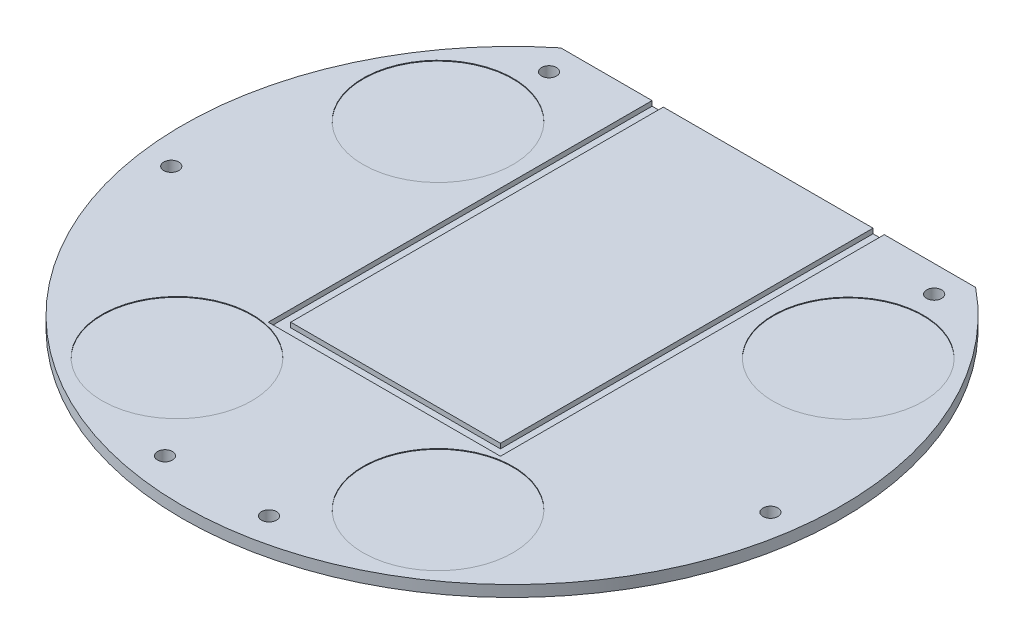
ISO-10303-21;
HEADER;
FILE_DESCRIPTION(('STEP AP214'),'2;1');
FILE_NAME('part.step','',(''),(''),'','','');
FILE_SCHEMA(('AUTOMOTIVE_DESIGN { 1 0 10303 214 1 1 1 1 }'));
ENDSEC;
DATA;
#1=APPLICATION_CONTEXT('core data for automotive mechanical design processes');
#2=APPLICATION_PROTOCOL_DEFINITION('international standard','automotive_design',2000,#1);
#3=PRODUCT_CONTEXT('',#1,'mechanical');
#4=PRODUCT('Part','Part','',(#3));
#5=PRODUCT_RELATED_PRODUCT_CATEGORY('part','',(#4));
#6=PRODUCT_DEFINITION_FORMATION('','',#4);
#7=PRODUCT_DEFINITION_CONTEXT('part definition',#1,'design');
#8=PRODUCT_DEFINITION('design','',#6,#7);
#9=PRODUCT_DEFINITION_SHAPE('','',#8);
#10=(LENGTH_UNIT() NAMED_UNIT(*) SI_UNIT(.MILLI.,.METRE.));
#11=(NAMED_UNIT(*) PLANE_ANGLE_UNIT() SI_UNIT($,.RADIAN.));
#12=(NAMED_UNIT(*) SI_UNIT($,.STERADIAN.) SOLID_ANGLE_UNIT());
#13=UNCERTAINTY_MEASURE_WITH_UNIT(LENGTH_MEASURE(1.E-05),#10,'distance_accuracy_value','');
#14=(GEOMETRIC_REPRESENTATION_CONTEXT(3) GLOBAL_UNCERTAINTY_ASSIGNED_CONTEXT((#13)) GLOBAL_UNIT_ASSIGNED_CONTEXT((#10,
#11,#12)) REPRESENTATION_CONTEXT('',''));
#15=CARTESIAN_POINT('',(0.,0.,0.));
#16=DIRECTION('',(0.,0.,1.));
#17=DIRECTION('',(1.,0.,0.));
#18=AXIS2_PLACEMENT_3D('',#15,#16,#17);
#19=CARTESIAN_POINT('',(0.,3.,-68.3888446082133));
#20=DIRECTION('',(0.,0.,1.));
#21=DIRECTION('',(1.,0.,0.));
#22=AXIS2_PLACEMENT_3D('',#19,#20,#21);
#23=PLANE('',#22);
#24=DIRECTION('',(0.,1.,0.));
#25=VECTOR('',#24,1.);
#26=CARTESIAN_POINT('',(28.,1.7,-68.3888446082133));
#27=LINE('',#26,#25);
#28=CARTESIAN_POINT('',(28.,1.7,-68.3888446082133));
#29=VERTEX_POINT('',#28);
#30=CARTESIAN_POINT('',(28.,3.,-68.3888446082133));
#31=VERTEX_POINT('',#30);
#32=EDGE_CURVE('E209',#29,#31,#27,.T.);
#33=ORIENTED_EDGE('',*,*,#32,.F.);
#34=DIRECTION('',(-1.,0.,0.));
#35=VECTOR('',#34,1.);
#36=CARTESIAN_POINT('',(0.,1.7,-68.3888446082133));
#37=LINE('',#36,#35);
#38=CARTESIAN_POINT('',(31.,1.7,-68.3888446082133));
#39=VERTEX_POINT('',#38);
#40=EDGE_CURVE('E166',#39,#29,#37,.T.);
#41=ORIENTED_EDGE('',*,*,#40,.F.);
#42=DIRECTION('',(0.,1.,0.));
#43=VECTOR('',#42,1.);
#44=CARTESIAN_POINT('',(31.,1.7,-68.3888446082133));
#45=LINE('',#44,#43);
#46=CARTESIAN_POINT('',(31.,3.,-68.3888446082133));
#47=VERTEX_POINT('',#46);
#48=EDGE_CURVE('E212',#39,#47,#45,.T.);
#49=ORIENTED_EDGE('',*,*,#48,.T.);
#50=DIRECTION('',(-1.,0.,0.));
#51=VECTOR('',#50,1.);
#52=CARTESIAN_POINT('',(0.,3.,-68.3888446082133));
#53=LINE('',#52,#51);
#54=CARTESIAN_POINT('',(55.3801944123858,3.,-68.3888446082133));
#55=VERTEX_POINT('',#54);
#56=EDGE_CURVE('E88',#55,#47,#53,.T.);
#57=ORIENTED_EDGE('',*,*,#56,.F.);
#58=DIRECTION('',(0.,-1.,0.));
#59=VECTOR('',#58,1.);
#60=CARTESIAN_POINT('',(55.3801944123858,3.,-68.3888446082133));
#61=LINE('',#60,#59);
#62=CARTESIAN_POINT('',(55.3801944123858,0.,-68.3888446082133));
#63=VERTEX_POINT('',#62);
#64=EDGE_CURVE('E11',#55,#63,#61,.T.);
#65=ORIENTED_EDGE('',*,*,#64,.T.);
#66=DIRECTION('',(-1.,0.,0.));
#67=VECTOR('',#66,1.);
#68=CARTESIAN_POINT('',(0.,0.,-68.3888446082133));
#69=LINE('',#68,#67);
#70=CARTESIAN_POINT('',(-55.3801944123858,0.,-68.3888446082133));
#71=VERTEX_POINT('',#70);
#72=EDGE_CURVE('E76',#63,#71,#69,.T.);
#73=ORIENTED_EDGE('',*,*,#72,.T.);
#74=DIRECTION('',(0.,-1.,0.));
#75=VECTOR('',#74,1.);
#76=CARTESIAN_POINT('',(-55.3801944123858,3.,-68.3888446082133));
#77=LINE('',#76,#75);
#78=CARTESIAN_POINT('',(-55.3801944123858,3.,-68.3888446082133));
#79=VERTEX_POINT('',#78);
#80=EDGE_CURVE('E47',#79,#71,#77,.T.);
#81=ORIENTED_EDGE('',*,*,#80,.F.);
#82=CARTESIAN_POINT('',(-31.,3.,-68.3888446082133));
#83=VERTEX_POINT('',#82);
#84=EDGE_CURVE('E64',#83,#79,#53,.T.);
#85=ORIENTED_EDGE('',*,*,#84,.F.);
#86=DIRECTION('',(0.,1.,0.));
#87=VECTOR('',#86,1.);
#88=CARTESIAN_POINT('',(-31.,1.7,-68.3888446082133));
#89=LINE('',#88,#87);
#90=CARTESIAN_POINT('',(-31.,1.7,-68.3888446082133));
#91=VERTEX_POINT('',#90);
#92=EDGE_CURVE('E93',#91,#83,#89,.T.);
#93=ORIENTED_EDGE('',*,*,#92,.F.);
#94=CARTESIAN_POINT('',(-28.,1.7,-68.3888446082133));
#95=VERTEX_POINT('',#94);
#96=EDGE_CURVE('E170',#95,#91,#37,.T.);
#97=ORIENTED_EDGE('',*,*,#96,.F.);
#98=DIRECTION('',(0.,1.,0.));
#99=VECTOR('',#98,1.);
#100=CARTESIAN_POINT('',(-28.,1.7,-68.3888446082133));
#101=LINE('',#100,#99);
#102=CARTESIAN_POINT('',(-28.,3.,-68.3888446082133));
#103=VERTEX_POINT('',#102);
#104=EDGE_CURVE('E200',#95,#103,#101,.T.);
#105=ORIENTED_EDGE('',*,*,#104,.T.);
#106=EDGE_CURVE('E216',#31,#103,#53,.T.);
#107=ORIENTED_EDGE('',*,*,#106,.F.);
#108=EDGE_LOOP('',(#33,#41,#49,#57,#65,#73,#81,#85,#93,#97,#105,#107));
#109=FACE_BOUND('',#108,.T.);
#110=ADVANCED_FACE('F38',(#109),#23,.F.);
#111=CARTESIAN_POINT('',(0.,3.,0.));
#112=DIRECTION('',(0.,1.,0.));
#113=DIRECTION('',(0.,0.,1.));
#114=AXIS2_PLACEMENT_3D('',#111,#112,#113);
#115=PLANE('',#114);
#116=DIRECTION('',(0.,0.,-1.));
#117=VECTOR('',#116,1.);
#118=CARTESIAN_POINT('',(-28.,3.,0.));
#119=LINE('',#118,#117);
#120=CARTESIAN_POINT('',(-28.,3.,31.1));
#121=VERTEX_POINT('',#120);
#122=EDGE_CURVE('E193',#121,#103,#119,.T.);
#123=ORIENTED_EDGE('',*,*,#122,.F.);
#124=DIRECTION('',(1.,0.,0.));
#125=VECTOR('',#124,1.);
#126=CARTESIAN_POINT('',(0.,3.,31.1));
#127=LINE('',#126,#125);
#128=CARTESIAN_POINT('',(28.,3.,31.1));
#129=VERTEX_POINT('',#128);
#130=EDGE_CURVE('E190',#121,#129,#127,.T.);
#131=ORIENTED_EDGE('',*,*,#130,.T.);
#132=DIRECTION('',(0.,0.,-1.));
#133=VECTOR('',#132,1.);
#134=CARTESIAN_POINT('',(28.,3.,0.));
#135=LINE('',#134,#133);
#136=EDGE_CURVE('E187',#129,#31,#135,.T.);
#137=ORIENTED_EDGE('',*,*,#136,.T.);
#138=ORIENTED_EDGE('',*,*,#106,.T.);
#139=EDGE_LOOP('',(#123,#131,#137,#138));
#140=FACE_BOUND('',#139,.T.);
#141=ADVANCED_FACE('F271',(#140),#115,.T.);
#142=CARTESIAN_POINT('',(0.,3.,0.));
#143=DIRECTION('',(0.,-1.,0.));
#144=DIRECTION('',(0.,0.,-1.));
#145=AXIS2_PLACEMENT_3D('',#142,#143,#144);
#146=CYLINDRICAL_SURFACE('',#145,88.);
#147=CARTESIAN_POINT('',(0.,0.,0.));
#148=DIRECTION('',(0.,1.,0.));
#149=DIRECTION('',(0.,0.,1.));
#150=AXIS2_PLACEMENT_3D('',#147,#148,#149);
#151=CIRCLE('',#150,88.);
#152=EDGE_CURVE('E85',#71,#63,#151,.T.);
#153=ORIENTED_EDGE('',*,*,#152,.T.);
#154=ORIENTED_EDGE('',*,*,#64,.F.);
#155=CARTESIAN_POINT('',(0.,3.,0.));
#156=DIRECTION('',(0.,1.,0.));
#157=DIRECTION('',(0.,0.,1.));
#158=AXIS2_PLACEMENT_3D('',#155,#156,#157);
#159=CIRCLE('',#158,88.);
#160=EDGE_CURVE('E84',#79,#55,#159,.T.);
#161=ORIENTED_EDGE('',*,*,#160,.F.);
#162=ORIENTED_EDGE('',*,*,#80,.T.);
#163=EDGE_LOOP('',(#153,#154,#161,#162));
#164=FACE_BOUND('',#163,.T.);
#165=ADVANCED_FACE('F40',(#164),#146,.T.);
#166=CARTESIAN_POINT('',(-80.,3.,11.));
#167=DIRECTION('',(0.,1.,0.));
#168=DIRECTION('',(0.,0.,1.));
#169=AXIS2_PLACEMENT_3D('',#166,#167,#168);
#170=CIRCLE('',#169,2.);
#171=CARTESIAN_POINT('',(-80.,3.,13.));
#172=VERTEX_POINT('',#171);
#173=EDGE_CURVE('E99',#172,#172,#170,.T.);
#174=ORIENTED_EDGE('',*,*,#173,.F.);
#175=EDGE_LOOP('',(#174));
#176=FACE_BOUND('',#175,.T.);
#177=CARTESIAN_POINT('',(80.,3.,11.));
#178=DIRECTION('',(0.,1.,0.));
#179=DIRECTION('',(0.,0.,1.));
#180=AXIS2_PLACEMENT_3D('',#177,#178,#179);
#181=CIRCLE('',#180,2.);
#182=CARTESIAN_POINT('',(80.,3.,13.));
#183=VERTEX_POINT('',#182);
#184=EDGE_CURVE('E105',#183,#183,#181,.T.);
#185=ORIENTED_EDGE('',*,*,#184,.F.);
#186=EDGE_LOOP('',(#185));
#187=FACE_BOUND('',#186,.T.);
#188=CARTESIAN_POINT('',(-51.423008774923,3.,-61.2835554495184));
#189=DIRECTION('',(0.,1.,0.));
#190=DIRECTION('',(0.,0.,1.));
#191=AXIS2_PLACEMENT_3D('',#188,#189,#190);
#192=CIRCLE('',#191,2.);
#193=CARTESIAN_POINT('',(-51.423008774923,3.,-59.2835554495183));
#194=VERTEX_POINT('',#193);
#195=EDGE_CURVE('E103',#194,#194,#192,.T.);
#196=ORIENTED_EDGE('',*,*,#195,.F.);
#197=EDGE_LOOP('',(#196));
#198=FACE_BOUND('',#197,.T.);
#199=CARTESIAN_POINT('',(51.423008774923,3.,-61.2835554495184));
#200=DIRECTION('',(0.,1.,0.));
#201=DIRECTION('',(0.,0.,1.));
#202=AXIS2_PLACEMENT_3D('',#199,#200,#201);
#203=CIRCLE('',#202,2.);
#204=CARTESIAN_POINT('',(51.423008774923,3.,-59.2835554495183));
#205=VERTEX_POINT('',#204);
#206=EDGE_CURVE('E117',#205,#205,#203,.T.);
#207=ORIENTED_EDGE('',*,*,#206,.F.);
#208=EDGE_LOOP('',(#207));
#209=FACE_BOUND('',#208,.T.);
#210=CARTESIAN_POINT('',(13.8918542133542,3.,78.7846202409767));
#211=DIRECTION('',(0.,1.,0.));
#212=DIRECTION('',(0.,0.,1.));
#213=AXIS2_PLACEMENT_3D('',#210,#211,#212);
#214=CIRCLE('',#213,2.);
#215=CARTESIAN_POINT('',(13.8918542133542,3.,80.7846202409767));
#216=VERTEX_POINT('',#215);
#217=EDGE_CURVE('E123',#216,#216,#214,.T.);
#218=ORIENTED_EDGE('',*,*,#217,.F.);
#219=EDGE_LOOP('',(#218));
#220=FACE_BOUND('',#219,.T.);
#221=CARTESIAN_POINT('',(-13.8918542133542,3.,78.7846202409767));
#222=DIRECTION('',(0.,1.,0.));
#223=DIRECTION('',(0.,0.,1.));
#224=AXIS2_PLACEMENT_3D('',#221,#222,#223);
#225=CIRCLE('',#224,2.);
#226=CARTESIAN_POINT('',(-13.8918542133542,3.,80.7846202409767));
#227=VERTEX_POINT('',#226);
#228=EDGE_CURVE('E129',#227,#227,#225,.T.);
#229=ORIENTED_EDGE('',*,*,#228,.F.);
#230=EDGE_LOOP('',(#229));
#231=FACE_BOUND('',#230,.T.);
#232=CARTESIAN_POINT('',(54.772,3.,-35.));
#233=DIRECTION('',(0.,1.,0.));
#234=DIRECTION('',(0.,0.,1.));
#235=AXIS2_PLACEMENT_3D('',#232,#233,#234);
#236=CIRCLE('',#235,20.);
#237=CARTESIAN_POINT('',(54.772,3.,-15.));
#238=VERTEX_POINT('',#237);
#239=EDGE_CURVE('E135',#238,#238,#236,.T.);
#240=ORIENTED_EDGE('',*,*,#239,.F.);
#241=EDGE_LOOP('',(#240));
#242=FACE_BOUND('',#241,.T.);
#243=CARTESIAN_POINT('',(-54.772,3.,-35.));
#244=DIRECTION('',(0.,1.,0.));
#245=DIRECTION('',(0.,0.,1.));
#246=AXIS2_PLACEMENT_3D('',#243,#244,#245);
#247=CIRCLE('',#246,20.);
#248=CARTESIAN_POINT('',(-54.772,3.,-15.));
#249=VERTEX_POINT('',#248);
#250=EDGE_CURVE('E146',#249,#249,#247,.T.);
#251=ORIENTED_EDGE('',*,*,#250,.F.);
#252=EDGE_LOOP('',(#251));
#253=FACE_BOUND('',#252,.T.);
#254=CARTESIAN_POINT('',(-35.,3.,54.472));
#255=DIRECTION('',(0.,1.,0.));
#256=DIRECTION('',(0.,0.,1.));
#257=AXIS2_PLACEMENT_3D('',#254,#255,#256);
#258=CIRCLE('',#257,20.);
#259=CARTESIAN_POINT('',(-35.,3.,74.472));
#260=VERTEX_POINT('',#259);
#261=EDGE_CURVE('E140',#260,#260,#258,.T.);
#262=ORIENTED_EDGE('',*,*,#261,.F.);
#263=EDGE_LOOP('',(#262));
#264=FACE_BOUND('',#263,.T.);
#265=CARTESIAN_POINT('',(35.,3.,54.772));
#266=DIRECTION('',(0.,1.,0.));
#267=DIRECTION('',(0.,0.,1.));
#268=AXIS2_PLACEMENT_3D('',#265,#266,#267);
#269=CIRCLE('',#268,20.);
#270=CARTESIAN_POINT('',(35.,3.,74.772));
#271=VERTEX_POINT('',#270);
#272=EDGE_CURVE('E139',#271,#271,#269,.T.);
#273=ORIENTED_EDGE('',*,*,#272,.F.);
#274=EDGE_LOOP('',(#273));
#275=FACE_BOUND('',#274,.T.);
#276=DIRECTION('',(0.,0.,1.));
#277=VECTOR('',#276,1.);
#278=CARTESIAN_POINT('',(-31.,3.,0.));
#279=LINE('',#278,#277);
#280=CARTESIAN_POINT('',(-31.,3.,34.1));
#281=VERTEX_POINT('',#280);
#282=EDGE_CURVE('E163',#83,#281,#279,.T.);
#283=ORIENTED_EDGE('',*,*,#282,.F.);
#284=ORIENTED_EDGE('',*,*,#84,.T.);
#285=ORIENTED_EDGE('',*,*,#160,.T.);
#286=ORIENTED_EDGE('',*,*,#56,.T.);
#287=DIRECTION('',(0.,0.,1.));
#288=VECTOR('',#287,1.);
#289=CARTESIAN_POINT('',(31.,3.,0.));
#290=LINE('',#289,#288);
#291=CARTESIAN_POINT('',(31.,3.,34.1));
#292=VERTEX_POINT('',#291);
#293=EDGE_CURVE('E184',#47,#292,#290,.T.);
#294=ORIENTED_EDGE('',*,*,#293,.T.);
#295=DIRECTION('',(-1.,0.,0.));
#296=VECTOR('',#295,1.);
#297=CARTESIAN_POINT('',(0.,3.,34.1));
#298=LINE('',#297,#296);
#299=EDGE_CURVE('E55',#292,#281,#298,.T.);
#300=ORIENTED_EDGE('',*,*,#299,.T.);
#301=EDGE_LOOP('',(#283,#284,#285,#286,#294,#300));
#302=FACE_BOUND('',#301,.T.);
#303=ADVANCED_FACE('F219',(#176,#187,#198,#209,#220,#231,#242,#253,#264,#275,#302),#115,.T.);
#304=CARTESIAN_POINT('',(0.,0.,0.));
#305=DIRECTION('',(0.,1.,0.));
#306=DIRECTION('',(0.,0.,1.));
#307=AXIS2_PLACEMENT_3D('',#304,#305,#306);
#308=PLANE('',#307);
#309=CARTESIAN_POINT('',(-80.,0.,11.));
#310=DIRECTION('',(0.,1.,0.));
#311=DIRECTION('',(0.,0.,1.));
#312=AXIS2_PLACEMENT_3D('',#309,#310,#311);
#313=CIRCLE('',#312,2.);
#314=CARTESIAN_POINT('',(-80.,0.,13.));
#315=VERTEX_POINT('',#314);
#316=EDGE_CURVE('E42',#315,#315,#313,.T.);
#317=ORIENTED_EDGE('',*,*,#316,.T.);
#318=EDGE_LOOP('',(#317));
#319=FACE_BOUND('',#318,.T.);
#320=CARTESIAN_POINT('',(80.,0.,11.));
#321=DIRECTION('',(0.,1.,0.));
#322=DIRECTION('',(0.,0.,1.));
#323=AXIS2_PLACEMENT_3D('',#320,#321,#322);
#324=CIRCLE('',#323,2.);
#325=CARTESIAN_POINT('',(80.,0.,13.));
#326=VERTEX_POINT('',#325);
#327=EDGE_CURVE('E97',#326,#326,#324,.T.);
#328=ORIENTED_EDGE('',*,*,#327,.T.);
#329=EDGE_LOOP('',(#328));
#330=FACE_BOUND('',#329,.T.);
#331=CARTESIAN_POINT('',(-51.423008774923,0.,-61.2835554495184));
#332=DIRECTION('',(0.,1.,0.));
#333=DIRECTION('',(0.,0.,1.));
#334=AXIS2_PLACEMENT_3D('',#331,#332,#333);
#335=CIRCLE('',#334,2.);
#336=CARTESIAN_POINT('',(-51.423008774923,0.,-59.2835554495183));
#337=VERTEX_POINT('',#336);
#338=EDGE_CURVE('E114',#337,#337,#335,.T.);
#339=ORIENTED_EDGE('',*,*,#338,.T.);
#340=EDGE_LOOP('',(#339));
#341=FACE_BOUND('',#340,.T.);
#342=CARTESIAN_POINT('',(51.423008774923,0.,-61.2835554495184));
#343=DIRECTION('',(0.,1.,0.));
#344=DIRECTION('',(0.,0.,1.));
#345=AXIS2_PLACEMENT_3D('',#342,#343,#344);
#346=CIRCLE('',#345,2.);
#347=CARTESIAN_POINT('',(51.423008774923,0.,-59.2835554495183));
#348=VERTEX_POINT('',#347);
#349=EDGE_CURVE('E120',#348,#348,#346,.T.);
#350=ORIENTED_EDGE('',*,*,#349,.T.);
#351=EDGE_LOOP('',(#350));
#352=FACE_BOUND('',#351,.T.);
#353=CARTESIAN_POINT('',(13.8918542133542,0.,78.7846202409767));
#354=DIRECTION('',(0.,1.,0.));
#355=DIRECTION('',(0.,0.,1.));
#356=AXIS2_PLACEMENT_3D('',#353,#354,#355);
#357=CIRCLE('',#356,2.);
#358=CARTESIAN_POINT('',(13.8918542133542,0.,80.7846202409767));
#359=VERTEX_POINT('',#358);
#360=EDGE_CURVE('E126',#359,#359,#357,.T.);
#361=ORIENTED_EDGE('',*,*,#360,.T.);
#362=EDGE_LOOP('',(#361));
#363=FACE_BOUND('',#362,.T.);
#364=CARTESIAN_POINT('',(-13.8918542133542,0.,78.7846202409767));
#365=DIRECTION('',(0.,1.,0.));
#366=DIRECTION('',(0.,0.,1.));
#367=AXIS2_PLACEMENT_3D('',#364,#365,#366);
#368=CIRCLE('',#367,2.);
#369=CARTESIAN_POINT('',(-13.8918542133542,0.,80.7846202409767));
#370=VERTEX_POINT('',#369);
#371=EDGE_CURVE('E132',#370,#370,#368,.T.);
#372=ORIENTED_EDGE('',*,*,#371,.T.);
#373=EDGE_LOOP('',(#372));
#374=FACE_BOUND('',#373,.T.);
#375=ORIENTED_EDGE('',*,*,#152,.F.);
#376=ORIENTED_EDGE('',*,*,#72,.F.);
#377=EDGE_LOOP('',(#375,#376));
#378=FACE_BOUND('',#377,.T.);
#379=ADVANCED_FACE('F90',(#319,#330,#341,#352,#363,#374,#378),#308,.F.);
#380=CARTESIAN_POINT('',(0.,1.7,34.1));
#381=DIRECTION('',(0.,0.,-1.));
#382=DIRECTION('',(-1.,0.,0.));
#383=AXIS2_PLACEMENT_3D('',#380,#381,#382);
#384=PLANE('',#383);
#385=ORIENTED_EDGE('',*,*,#299,.F.);
#386=DIRECTION('',(0.,1.,0.));
#387=VECTOR('',#386,1.);
#388=CARTESIAN_POINT('',(31.,1.7,34.1));
#389=LINE('',#388,#387);
#390=CARTESIAN_POINT('',(31.,1.7,34.1));
#391=VERTEX_POINT('',#390);
#392=EDGE_CURVE('E182',#391,#292,#389,.T.);
#393=ORIENTED_EDGE('',*,*,#392,.F.);
#394=DIRECTION('',(-1.,0.,0.));
#395=VECTOR('',#394,1.);
#396=CARTESIAN_POINT('',(0.,1.7,34.1));
#397=LINE('',#396,#395);
#398=CARTESIAN_POINT('',(-31.,1.7,34.1));
#399=VERTEX_POINT('',#398);
#400=EDGE_CURVE('E159',#391,#399,#397,.T.);
#401=ORIENTED_EDGE('',*,*,#400,.T.);
#402=DIRECTION('',(0.,1.,0.));
#403=VECTOR('',#402,1.);
#404=CARTESIAN_POINT('',(-31.,1.7,34.1));
#405=LINE('',#404,#403);
#406=EDGE_CURVE('E91',#399,#281,#405,.T.);
#407=ORIENTED_EDGE('',*,*,#406,.T.);
#408=EDGE_LOOP('',(#385,#393,#401,#407));
#409=FACE_BOUND('',#408,.T.);
#410=ADVANCED_FACE('F241',(#409),#384,.T.);
#411=CARTESIAN_POINT('',(-31.,1.7,0.));
#412=DIRECTION('',(-1.,0.,0.));
#413=DIRECTION('',(0.,0.,1.));
#414=AXIS2_PLACEMENT_3D('',#411,#412,#413);
#415=PLANE('',#414);
#416=ORIENTED_EDGE('',*,*,#282,.T.);
#417=ORIENTED_EDGE('',*,*,#406,.F.);
#418=DIRECTION('',(0.,0.,1.));
#419=VECTOR('',#418,1.);
#420=CARTESIAN_POINT('',(-31.,1.7,0.));
#421=LINE('',#420,#419);
#422=EDGE_CURVE('E179',#91,#399,#421,.T.);
#423=ORIENTED_EDGE('',*,*,#422,.F.);
#424=ORIENTED_EDGE('',*,*,#92,.T.);
#425=EDGE_LOOP('',(#416,#417,#423,#424));
#426=FACE_BOUND('',#425,.T.);
#427=ADVANCED_FACE('F245',(#426),#415,.F.);
#428=CARTESIAN_POINT('',(-28.,1.7,0.));
#429=DIRECTION('',(1.,0.,0.));
#430=DIRECTION('',(0.,0.,-1.));
#431=AXIS2_PLACEMENT_3D('',#428,#429,#430);
#432=PLANE('',#431);
#433=ORIENTED_EDGE('',*,*,#122,.T.);
#434=ORIENTED_EDGE('',*,*,#104,.F.);
#435=DIRECTION('',(0.,0.,-1.));
#436=VECTOR('',#435,1.);
#437=CARTESIAN_POINT('',(-28.,1.7,0.));
#438=LINE('',#437,#436);
#439=CARTESIAN_POINT('',(-28.,1.7,31.1));
#440=VERTEX_POINT('',#439);
#441=EDGE_CURVE('E176',#440,#95,#438,.T.);
#442=ORIENTED_EDGE('',*,*,#441,.F.);
#443=DIRECTION('',(0.,1.,0.));
#444=VECTOR('',#443,1.);
#445=CARTESIAN_POINT('',(-28.,1.7,31.1));
#446=LINE('',#445,#444);
#447=EDGE_CURVE('E203',#440,#121,#446,.T.);
#448=ORIENTED_EDGE('',*,*,#447,.T.);
#449=EDGE_LOOP('',(#433,#434,#442,#448));
#450=FACE_BOUND('',#449,.T.);
#451=ADVANCED_FACE('F265',(#450),#432,.F.);
#452=CARTESIAN_POINT('',(0.,1.7,31.1));
#453=DIRECTION('',(0.,0.,1.));
#454=DIRECTION('',(1.,0.,0.));
#455=AXIS2_PLACEMENT_3D('',#452,#453,#454);
#456=PLANE('',#455);
#457=ORIENTED_EDGE('',*,*,#130,.F.);
#458=ORIENTED_EDGE('',*,*,#447,.F.);
#459=DIRECTION('',(1.,0.,0.));
#460=VECTOR('',#459,1.);
#461=CARTESIAN_POINT('',(0.,1.7,31.1));
#462=LINE('',#461,#460);
#463=CARTESIAN_POINT('',(28.,1.7,31.1));
#464=VERTEX_POINT('',#463);
#465=EDGE_CURVE('E173',#440,#464,#462,.T.);
#466=ORIENTED_EDGE('',*,*,#465,.T.);
#467=DIRECTION('',(0.,1.,0.));
#468=VECTOR('',#467,1.);
#469=CARTESIAN_POINT('',(28.,1.7,31.1));
#470=LINE('',#469,#468);
#471=EDGE_CURVE('E206',#464,#129,#470,.T.);
#472=ORIENTED_EDGE('',*,*,#471,.T.);
#473=EDGE_LOOP('',(#457,#458,#466,#472));
#474=FACE_BOUND('',#473,.T.);
#475=ADVANCED_FACE('F281',(#474),#456,.T.);
#476=CARTESIAN_POINT('',(28.,1.7,0.));
#477=DIRECTION('',(1.,0.,0.));
#478=DIRECTION('',(0.,0.,-1.));
#479=AXIS2_PLACEMENT_3D('',#476,#477,#478);
#480=PLANE('',#479);
#481=ORIENTED_EDGE('',*,*,#136,.F.);
#482=ORIENTED_EDGE('',*,*,#471,.F.);
#483=DIRECTION('',(0.,0.,-1.));
#484=VECTOR('',#483,1.);
#485=CARTESIAN_POINT('',(28.,1.7,0.));
#486=LINE('',#485,#484);
#487=EDGE_CURVE('E169',#464,#29,#486,.T.);
#488=ORIENTED_EDGE('',*,*,#487,.T.);
#489=ORIENTED_EDGE('',*,*,#32,.T.);
#490=EDGE_LOOP('',(#481,#482,#488,#489));
#491=FACE_BOUND('',#490,.T.);
#492=ADVANCED_FACE('F275',(#491),#480,.T.);
#493=CARTESIAN_POINT('',(31.,1.7,0.));
#494=DIRECTION('',(-1.,0.,0.));
#495=DIRECTION('',(0.,0.,1.));
#496=AXIS2_PLACEMENT_3D('',#493,#494,#495);
#497=PLANE('',#496);
#498=ORIENTED_EDGE('',*,*,#293,.F.);
#499=ORIENTED_EDGE('',*,*,#48,.F.);
#500=DIRECTION('',(0.,0.,1.));
#501=VECTOR('',#500,1.);
#502=CARTESIAN_POINT('',(31.,1.7,0.));
#503=LINE('',#502,#501);
#504=EDGE_CURVE('E162',#39,#391,#503,.T.);
#505=ORIENTED_EDGE('',*,*,#504,.T.);
#506=ORIENTED_EDGE('',*,*,#392,.T.);
#507=EDGE_LOOP('',(#498,#499,#505,#506));
#508=FACE_BOUND('',#507,.T.);
#509=ADVANCED_FACE('F228',(#508),#497,.T.);
#510=CARTESIAN_POINT('',(0.,1.7,0.));
#511=DIRECTION('',(0.,1.,0.));
#512=DIRECTION('',(0.,0.,1.));
#513=AXIS2_PLACEMENT_3D('',#510,#511,#512);
#514=PLANE('',#513);
#515=ORIENTED_EDGE('',*,*,#400,.F.);
#516=ORIENTED_EDGE('',*,*,#504,.F.);
#517=ORIENTED_EDGE('',*,*,#40,.T.);
#518=ORIENTED_EDGE('',*,*,#487,.F.);
#519=ORIENTED_EDGE('',*,*,#465,.F.);
#520=ORIENTED_EDGE('',*,*,#441,.T.);
#521=ORIENTED_EDGE('',*,*,#96,.T.);
#522=ORIENTED_EDGE('',*,*,#422,.T.);
#523=EDGE_LOOP('',(#515,#516,#517,#518,#519,#520,#521,#522));
#524=FACE_BOUND('',#523,.T.);
#525=ADVANCED_FACE('F234',(#524),#514,.T.);
#526=CARTESIAN_POINT('',(35.,2.8,54.772));
#527=DIRECTION('',(0.,1.,0.));
#528=DIRECTION('',(0.,0.,1.));
#529=AXIS2_PLACEMENT_3D('',#526,#527,#528);
#530=CYLINDRICAL_SURFACE('',#529,20.);
#531=CARTESIAN_POINT('',(35.,2.8,54.772));
#532=DIRECTION('',(0.,1.,0.));
#533=DIRECTION('',(0.,0.,1.));
#534=AXIS2_PLACEMENT_3D('',#531,#532,#533);
#535=CIRCLE('',#534,20.);
#536=CARTESIAN_POINT('',(35.,2.8,74.772));
#537=VERTEX_POINT('',#536);
#538=EDGE_CURVE('E154',#537,#537,#535,.T.);
#539=ORIENTED_EDGE('',*,*,#538,.F.);
#540=EDGE_LOOP('',(#539));
#541=FACE_BOUND('',#540,.T.);
#542=ORIENTED_EDGE('',*,*,#272,.T.);
#543=EDGE_LOOP('',(#542));
#544=FACE_BOUND('',#543,.T.);
#545=ADVANCED_FACE('F307',(#541,#544),#530,.F.);
#546=CARTESIAN_POINT('',(0.,2.8,0.));
#547=DIRECTION('',(0.,1.,0.));
#548=DIRECTION('',(0.,0.,1.));
#549=AXIS2_PLACEMENT_3D('',#546,#547,#548);
#550=PLANE('',#549);
#551=ORIENTED_EDGE('',*,*,#538,.T.);
#552=EDGE_LOOP('',(#551));
#553=FACE_BOUND('',#552,.T.);
#554=ADVANCED_FACE('F312',(#553),#550,.T.);
#555=CARTESIAN_POINT('',(-35.,2.8,54.472));
#556=DIRECTION('',(0.,1.,0.));
#557=DIRECTION('',(0.,0.,1.));
#558=AXIS2_PLACEMENT_3D('',#555,#556,#557);
#559=CYLINDRICAL_SURFACE('',#558,20.);
#560=CARTESIAN_POINT('',(-35.,2.8,54.472));
#561=DIRECTION('',(0.,1.,0.));
#562=DIRECTION('',(0.,0.,1.));
#563=AXIS2_PLACEMENT_3D('',#560,#561,#562);
#564=CIRCLE('',#563,20.);
#565=CARTESIAN_POINT('',(-35.,2.8,74.472));
#566=VERTEX_POINT('',#565);
#567=EDGE_CURVE('E136',#566,#566,#564,.T.);
#568=ORIENTED_EDGE('',*,*,#567,.F.);
#569=EDGE_LOOP('',(#568));
#570=FACE_BOUND('',#569,.T.);
#571=ORIENTED_EDGE('',*,*,#261,.T.);
#572=EDGE_LOOP('',(#571));
#573=FACE_BOUND('',#572,.T.);
#574=ADVANCED_FACE('F365',(#570,#573),#559,.F.);
#575=CARTESIAN_POINT('',(0.,2.8,0.));
#576=DIRECTION('',(0.,1.,0.));
#577=DIRECTION('',(0.,0.,1.));
#578=AXIS2_PLACEMENT_3D('',#575,#576,#577);
#579=PLANE('',#578);
#580=ORIENTED_EDGE('',*,*,#567,.T.);
#581=EDGE_LOOP('',(#580));
#582=FACE_BOUND('',#581,.T.);
#583=ADVANCED_FACE('F375',(#582),#579,.T.);
#584=CARTESIAN_POINT('',(-54.772,2.8,-35.));
#585=DIRECTION('',(0.,1.,0.));
#586=DIRECTION('',(0.,0.,1.));
#587=AXIS2_PLACEMENT_3D('',#584,#585,#586);
#588=CYLINDRICAL_SURFACE('',#587,20.);
#589=CARTESIAN_POINT('',(-54.772,2.8,-35.));
#590=DIRECTION('',(0.,1.,0.));
#591=DIRECTION('',(0.,0.,1.));
#592=AXIS2_PLACEMENT_3D('',#589,#590,#591);
#593=CIRCLE('',#592,20.);
#594=CARTESIAN_POINT('',(-54.772,2.8,-15.));
#595=VERTEX_POINT('',#594);
#596=EDGE_CURVE('E143',#595,#595,#593,.T.);
#597=ORIENTED_EDGE('',*,*,#596,.F.);
#598=EDGE_LOOP('',(#597));
#599=FACE_BOUND('',#598,.T.);
#600=ORIENTED_EDGE('',*,*,#250,.T.);
#601=EDGE_LOOP('',(#600));
#602=FACE_BOUND('',#601,.T.);
#603=ADVANCED_FACE('F386',(#599,#602),#588,.F.);
#604=CARTESIAN_POINT('',(0.,2.8,0.));
#605=DIRECTION('',(0.,1.,0.));
#606=DIRECTION('',(0.,0.,1.));
#607=AXIS2_PLACEMENT_3D('',#604,#605,#606);
#608=PLANE('',#607);
#609=ORIENTED_EDGE('',*,*,#596,.T.);
#610=EDGE_LOOP('',(#609));
#611=FACE_BOUND('',#610,.T.);
#612=ADVANCED_FACE('F397',(#611),#608,.T.);
#613=CARTESIAN_POINT('',(54.772,2.8,-35.));
#614=DIRECTION('',(0.,1.,0.));
#615=DIRECTION('',(0.,0.,1.));
#616=AXIS2_PLACEMENT_3D('',#613,#614,#615);
#617=CYLINDRICAL_SURFACE('',#616,20.);
#618=CARTESIAN_POINT('',(54.772,2.8,-35.));
#619=DIRECTION('',(0.,1.,0.));
#620=DIRECTION('',(0.,0.,1.));
#621=AXIS2_PLACEMENT_3D('',#618,#619,#620);
#622=CIRCLE('',#621,20.);
#623=CARTESIAN_POINT('',(54.772,2.8,-15.));
#624=VERTEX_POINT('',#623);
#625=EDGE_CURVE('E149',#624,#624,#622,.T.);
#626=ORIENTED_EDGE('',*,*,#625,.F.);
#627=EDGE_LOOP('',(#626));
#628=FACE_BOUND('',#627,.T.);
#629=ORIENTED_EDGE('',*,*,#239,.T.);
#630=EDGE_LOOP('',(#629));
#631=FACE_BOUND('',#630,.T.);
#632=ADVANCED_FACE('F408',(#628,#631),#617,.F.);
#633=CARTESIAN_POINT('',(0.,2.8,0.));
#634=DIRECTION('',(0.,1.,0.));
#635=DIRECTION('',(0.,0.,1.));
#636=AXIS2_PLACEMENT_3D('',#633,#634,#635);
#637=PLANE('',#636);
#638=ORIENTED_EDGE('',*,*,#625,.T.);
#639=EDGE_LOOP('',(#638));
#640=FACE_BOUND('',#639,.T.);
#641=ADVANCED_FACE('F419',(#640),#637,.T.);
#642=CARTESIAN_POINT('',(-13.8918542133542,3.,78.7846202409767));
#643=DIRECTION('',(0.,1.,0.));
#644=DIRECTION('',(0.,0.,1.));
#645=AXIS2_PLACEMENT_3D('',#642,#643,#644);
#646=CYLINDRICAL_SURFACE('',#645,2.);
#647=ORIENTED_EDGE('',*,*,#371,.F.);
#648=EDGE_LOOP('',(#647));
#649=FACE_BOUND('',#648,.T.);
#650=ORIENTED_EDGE('',*,*,#228,.T.);
#651=EDGE_LOOP('',(#650));
#652=FACE_BOUND('',#651,.T.);
#653=ADVANCED_FACE('F430',(#649,#652),#646,.F.);
#654=CARTESIAN_POINT('',(13.8918542133542,3.,78.7846202409767));
#655=DIRECTION('',(0.,1.,0.));
#656=DIRECTION('',(0.,0.,1.));
#657=AXIS2_PLACEMENT_3D('',#654,#655,#656);
#658=CYLINDRICAL_SURFACE('',#657,2.);
#659=ORIENTED_EDGE('',*,*,#360,.F.);
#660=EDGE_LOOP('',(#659));
#661=FACE_BOUND('',#660,.T.);
#662=ORIENTED_EDGE('',*,*,#217,.T.);
#663=EDGE_LOOP('',(#662));
#664=FACE_BOUND('',#663,.T.);
#665=ADVANCED_FACE('F441',(#661,#664),#658,.F.);
#666=CARTESIAN_POINT('',(51.423008774923,3.,-61.2835554495184));
#667=DIRECTION('',(0.,1.,0.));
#668=DIRECTION('',(0.,0.,1.));
#669=AXIS2_PLACEMENT_3D('',#666,#667,#668);
#670=CYLINDRICAL_SURFACE('',#669,2.);
#671=ORIENTED_EDGE('',*,*,#349,.F.);
#672=EDGE_LOOP('',(#671));
#673=FACE_BOUND('',#672,.T.);
#674=ORIENTED_EDGE('',*,*,#206,.T.);
#675=EDGE_LOOP('',(#674));
#676=FACE_BOUND('',#675,.T.);
#677=ADVANCED_FACE('F452',(#673,#676),#670,.F.);
#678=CARTESIAN_POINT('',(-51.423008774923,3.,-61.2835554495184));
#679=DIRECTION('',(0.,1.,0.));
#680=DIRECTION('',(0.,0.,1.));
#681=AXIS2_PLACEMENT_3D('',#678,#679,#680);
#682=CYLINDRICAL_SURFACE('',#681,2.);
#683=ORIENTED_EDGE('',*,*,#338,.F.);
#684=EDGE_LOOP('',(#683));
#685=FACE_BOUND('',#684,.T.);
#686=ORIENTED_EDGE('',*,*,#195,.T.);
#687=EDGE_LOOP('',(#686));
#688=FACE_BOUND('',#687,.T.);
#689=ADVANCED_FACE('F463',(#685,#688),#682,.F.);
#690=CARTESIAN_POINT('',(80.,-16.,11.));
#691=DIRECTION('',(0.,1.,0.));
#692=DIRECTION('',(0.,0.,1.));
#693=AXIS2_PLACEMENT_3D('',#690,#691,#692);
#694=CYLINDRICAL_SURFACE('',#693,2.);
#695=ORIENTED_EDGE('',*,*,#184,.T.);
#696=EDGE_LOOP('',(#695));
#697=FACE_BOUND('',#696,.T.);
#698=ORIENTED_EDGE('',*,*,#327,.F.);
#699=EDGE_LOOP('',(#698));
#700=FACE_BOUND('',#699,.T.);
#701=ADVANCED_FACE('F474',(#697,#700),#694,.F.);
#702=CARTESIAN_POINT('',(-80.,-16.,11.));
#703=DIRECTION('',(0.,1.,0.));
#704=DIRECTION('',(0.,0.,1.));
#705=AXIS2_PLACEMENT_3D('',#702,#703,#704);
#706=CYLINDRICAL_SURFACE('',#705,2.);
#707=ORIENTED_EDGE('',*,*,#173,.T.);
#708=EDGE_LOOP('',(#707));
#709=FACE_BOUND('',#708,.T.);
#710=ORIENTED_EDGE('',*,*,#316,.F.);
#711=EDGE_LOOP('',(#710));
#712=FACE_BOUND('',#711,.T.);
#713=ADVANCED_FACE('F502',(#709,#712),#706,.F.);
#714=CLOSED_SHELL('',(#110,#141,#165,#303,#379,#410,#427,#451,#475,#492,#509,#525,#545,#554,
#574,#583,#603,#612,#632,#641,#653,#665,#677,#689,#701,#713));
#715=MANIFOLD_SOLID_BREP('B2',#714);
#716=ADVANCED_BREP_SHAPE_REPRESENTATION('',(#18,#715),#14);
#717=SHAPE_DEFINITION_REPRESENTATION(#9,#716);
ENDSEC;
END-ISO-10303-21;
